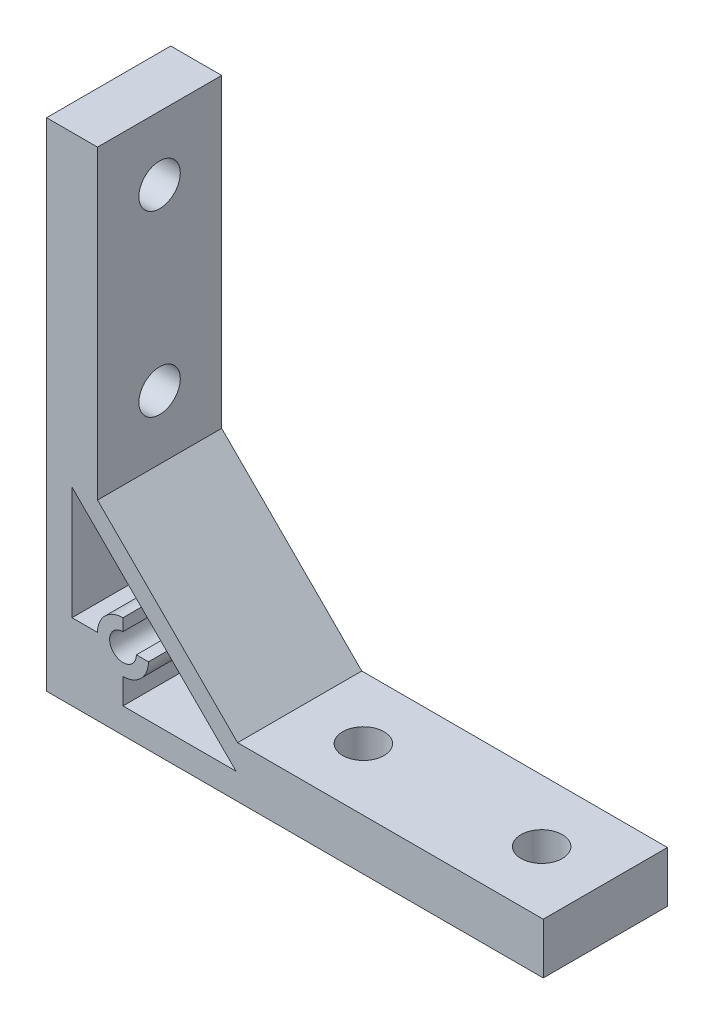
ISO-10303-21;
HEADER;
FILE_DESCRIPTION(('STEP AP214'),'2;1');
FILE_NAME('part.step','',(''),(''),'','','');
FILE_SCHEMA(('AUTOMOTIVE_DESIGN { 1 0 10303 214 1 1 1 1 }'));
ENDSEC;
DATA;
#1=APPLICATION_CONTEXT('core data for automotive mechanical design processes');
#2=APPLICATION_PROTOCOL_DEFINITION('international standard','automotive_design',2000,#1);
#3=PRODUCT_CONTEXT('',#1,'mechanical');
#4=PRODUCT('Part','Part','',(#3));
#5=PRODUCT_RELATED_PRODUCT_CATEGORY('part','',(#4));
#6=PRODUCT_DEFINITION_FORMATION('','',#4);
#7=PRODUCT_DEFINITION_CONTEXT('part definition',#1,'design');
#8=PRODUCT_DEFINITION('design','',#6,#7);
#9=PRODUCT_DEFINITION_SHAPE('','',#8);
#10=(LENGTH_UNIT() NAMED_UNIT(*) SI_UNIT(.MILLI.,.METRE.));
#11=(NAMED_UNIT(*) PLANE_ANGLE_UNIT() SI_UNIT($,.RADIAN.));
#12=(NAMED_UNIT(*) SI_UNIT($,.STERADIAN.) SOLID_ANGLE_UNIT());
#13=UNCERTAINTY_MEASURE_WITH_UNIT(LENGTH_MEASURE(1.E-05),#10,'distance_accuracy_value','');
#14=(GEOMETRIC_REPRESENTATION_CONTEXT(3) GLOBAL_UNCERTAINTY_ASSIGNED_CONTEXT((#13)) GLOBAL_UNIT_ASSIGNED_CONTEXT((#10,
#11,#12)) REPRESENTATION_CONTEXT('',''));
#15=CARTESIAN_POINT('',(0.,0.,0.));
#16=DIRECTION('',(0.,0.,1.));
#17=DIRECTION('',(1.,0.,0.));
#18=AXIS2_PLACEMENT_3D('',#15,#16,#17);
#19=CARTESIAN_POINT('',(6.44947396463209E-13,78.,19.5));
#20=DIRECTION('',(1.,0.,0.));
#21=DIRECTION('',(0.,1.,0.));
#22=AXIS2_PLACEMENT_3D('',#19,#20,#21);
#23=PLANE('',#22);
#24=CARTESIAN_POINT('',(5.62261740936825E-13,68.,9.75));
#25=DIRECTION('',(1.,0.,0.));
#26=DIRECTION('',(0.,1.,0.));
#27=AXIS2_PLACEMENT_3D('',#24,#25,#26);
#28=CIRCLE('',#27,3.25);
#29=CARTESIAN_POINT('',(5.89134549122793E-13,71.25,9.75));
#30=VERTEX_POINT('',#29);
#31=EDGE_CURVE('E329',#30,#30,#28,.F.);
#32=ORIENTED_EDGE('',*,*,#31,.F.);
#33=EDGE_LOOP('',(#32));
#34=FACE_BOUND('',#33,.T.);
#35=CARTESIAN_POINT('',(3.30742225463808E-13,40.,9.75));
#36=DIRECTION('',(1.,0.,0.));
#37=DIRECTION('',(0.,1.,0.));
#38=AXIS2_PLACEMENT_3D('',#35,#36,#37);
#39=CIRCLE('',#38,3.25);
#40=CARTESIAN_POINT('',(3.57615033649775E-13,43.25,9.75));
#41=VERTEX_POINT('',#40);
#42=EDGE_CURVE('E332',#41,#41,#39,.F.);
#43=ORIENTED_EDGE('',*,*,#42,.F.);
#44=EDGE_LOOP('',(#43));
#45=FACE_BOUND('',#44,.T.);
#46=DIRECTION('',(0.,-1.,0.));
#47=VECTOR('',#46,1.);
#48=CARTESIAN_POINT('',(6.44947396463209E-13,78.,0.));
#49=LINE('',#48,#47);
#50=CARTESIAN_POINT('',(6.44947396463209E-13,78.,0.));
#51=VERTEX_POINT('',#50);
#52=CARTESIAN_POINT('',(0.,0.,0.));
#53=VERTEX_POINT('',#52);
#54=EDGE_CURVE('E228',#51,#53,#49,.T.);
#55=ORIENTED_EDGE('',*,*,#54,.T.);
#56=DIRECTION('',(0.,0.,-1.));
#57=VECTOR('',#56,1.);
#58=CARTESIAN_POINT('',(0.,0.,19.5));
#59=LINE('',#58,#57);
#60=CARTESIAN_POINT('',(0.,0.,19.5));
#61=VERTEX_POINT('',#60);
#62=EDGE_CURVE('E41',#61,#53,#59,.T.);
#63=ORIENTED_EDGE('',*,*,#62,.F.);
#64=DIRECTION('',(0.,-1.,0.));
#65=VECTOR('',#64,1.);
#66=CARTESIAN_POINT('',(6.44947396463209E-13,78.,19.5));
#67=LINE('',#66,#65);
#68=CARTESIAN_POINT('',(6.44947396463209E-13,78.,19.5));
#69=VERTEX_POINT('',#68);
#70=EDGE_CURVE('E229',#69,#61,#67,.T.);
#71=ORIENTED_EDGE('',*,*,#70,.F.);
#72=DIRECTION('',(0.,0.,-1.));
#73=VECTOR('',#72,1.);
#74=CARTESIAN_POINT('',(6.44947396463209E-13,78.,19.5));
#75=LINE('',#74,#73);
#76=EDGE_CURVE('E245',#69,#51,#75,.T.);
#77=ORIENTED_EDGE('',*,*,#76,.T.);
#78=EDGE_LOOP('',(#55,#63,#71,#77));
#79=FACE_BOUND('',#78,.T.);
#80=ADVANCED_FACE('F34',(#34,#45,#79),#23,.F.);
#81=CARTESIAN_POINT('',(0.,0.,19.5));
#82=DIRECTION('',(0.,1.,0.));
#83=DIRECTION('',(0.,0.,1.));
#84=AXIS2_PLACEMENT_3D('',#81,#82,#83);
#85=PLANE('',#84);
#86=CARTESIAN_POINT('',(40.0000000000007,0.,9.75));
#87=DIRECTION('',(0.,1.,0.));
#88=DIRECTION('',(0.,0.,1.));
#89=AXIS2_PLACEMENT_3D('',#86,#87,#88);
#90=CIRCLE('',#89,3.25);
#91=CARTESIAN_POINT('',(40.0000000000007,0.,13.));
#92=VERTEX_POINT('',#91);
#93=EDGE_CURVE('E346',#92,#92,#90,.F.);
#94=ORIENTED_EDGE('',*,*,#93,.F.);
#95=EDGE_LOOP('',(#94));
#96=FACE_BOUND('',#95,.T.);
#97=CARTESIAN_POINT('',(68.0000000000007,0.,9.75));
#98=DIRECTION('',(0.,1.,0.));
#99=DIRECTION('',(0.,0.,1.));
#100=AXIS2_PLACEMENT_3D('',#97,#98,#99);
#101=CIRCLE('',#100,3.25000000000001);
#102=CARTESIAN_POINT('',(68.0000000000007,0.,13.));
#103=VERTEX_POINT('',#102);
#104=EDGE_CURVE('E347',#103,#103,#101,.F.);
#105=ORIENTED_EDGE('',*,*,#104,.F.);
#106=EDGE_LOOP('',(#105));
#107=FACE_BOUND('',#106,.T.);
#108=DIRECTION('',(1.,0.,0.));
#109=VECTOR('',#108,1.);
#110=CARTESIAN_POINT('',(0.,0.,0.));
#111=LINE('',#110,#109);
#112=CARTESIAN_POINT('',(78.,0.,0.));
#113=VERTEX_POINT('',#112);
#114=EDGE_CURVE('E248',#53,#113,#111,.T.);
#115=ORIENTED_EDGE('',*,*,#114,.T.);
#116=DIRECTION('',(0.,0.,-1.));
#117=VECTOR('',#116,1.);
#118=CARTESIAN_POINT('',(78.,0.,19.5));
#119=LINE('',#118,#117);
#120=CARTESIAN_POINT('',(78.,0.,19.5));
#121=VERTEX_POINT('',#120);
#122=EDGE_CURVE('E273',#121,#113,#119,.T.);
#123=ORIENTED_EDGE('',*,*,#122,.F.);
#124=DIRECTION('',(1.,0.,0.));
#125=VECTOR('',#124,1.);
#126=CARTESIAN_POINT('',(0.,0.,19.5));
#127=LINE('',#126,#125);
#128=EDGE_CURVE('E232',#61,#121,#127,.T.);
#129=ORIENTED_EDGE('',*,*,#128,.F.);
#130=ORIENTED_EDGE('',*,*,#62,.T.);
#131=EDGE_LOOP('',(#115,#123,#129,#130));
#132=FACE_BOUND('',#131,.T.);
#133=ADVANCED_FACE('F278',(#96,#107,#132),#85,.F.);
#134=CARTESIAN_POINT('',(78.,0.,19.5));
#135=DIRECTION('',(-1.,0.,0.));
#136=DIRECTION('',(0.,0.,1.));
#137=AXIS2_PLACEMENT_3D('',#134,#135,#136);
#138=PLANE('',#137);
#139=DIRECTION('',(0.,1.,0.));
#140=VECTOR('',#139,1.);
#141=CARTESIAN_POINT('',(78.,0.,0.));
#142=LINE('',#141,#140);
#143=CARTESIAN_POINT('',(78.,8.,0.));
#144=VERTEX_POINT('',#143);
#145=EDGE_CURVE('E250',#113,#144,#142,.T.);
#146=ORIENTED_EDGE('',*,*,#145,.T.);
#147=DIRECTION('',(0.,0.,-1.));
#148=VECTOR('',#147,1.);
#149=CARTESIAN_POINT('',(78.,8.,19.5));
#150=LINE('',#149,#148);
#151=CARTESIAN_POINT('',(78.,8.,19.5));
#152=VERTEX_POINT('',#151);
#153=EDGE_CURVE('E270',#152,#144,#150,.T.);
#154=ORIENTED_EDGE('',*,*,#153,.F.);
#155=DIRECTION('',(0.,1.,0.));
#156=VECTOR('',#155,1.);
#157=CARTESIAN_POINT('',(78.,0.,19.5));
#158=LINE('',#157,#156);
#159=EDGE_CURVE('E235',#121,#152,#158,.T.);
#160=ORIENTED_EDGE('',*,*,#159,.F.);
#161=ORIENTED_EDGE('',*,*,#122,.T.);
#162=EDGE_LOOP('',(#146,#154,#160,#161));
#163=FACE_BOUND('',#162,.T.);
#164=ADVANCED_FACE('F291',(#163),#138,.F.);
#165=CARTESIAN_POINT('',(78.,8.,19.5));
#166=DIRECTION('',(0.,-1.,0.));
#167=DIRECTION('',(1.,0.,0.));
#168=AXIS2_PLACEMENT_3D('',#165,#166,#167);
#169=PLANE('',#168);
#170=CARTESIAN_POINT('',(40.0000000000007,7.99999999999999,9.75));
#171=DIRECTION('',(0.,1.,0.));
#172=DIRECTION('',(-1.,0.,0.));
#173=AXIS2_PLACEMENT_3D('',#170,#171,#172);
#174=CIRCLE('',#173,3.25);
#175=CARTESIAN_POINT('',(36.7500000000007,7.99999999999999,9.75));
#176=VERTEX_POINT('',#175);
#177=EDGE_CURVE('E343',#176,#176,#174,.T.);
#178=ORIENTED_EDGE('',*,*,#177,.F.);
#179=EDGE_LOOP('',(#178));
#180=FACE_BOUND('',#179,.T.);
#181=CARTESIAN_POINT('',(68.0000000000007,8.,9.75));
#182=DIRECTION('',(0.,1.,0.));
#183=DIRECTION('',(-1.,0.,0.));
#184=AXIS2_PLACEMENT_3D('',#181,#182,#183);
#185=CIRCLE('',#184,3.25000000000001);
#186=CARTESIAN_POINT('',(64.7500000000007,8.,9.75));
#187=VERTEX_POINT('',#186);
#188=EDGE_CURVE('E350',#187,#187,#185,.T.);
#189=ORIENTED_EDGE('',*,*,#188,.F.);
#190=EDGE_LOOP('',(#189));
#191=FACE_BOUND('',#190,.T.);
#192=DIRECTION('',(-1.,0.,0.));
#193=VECTOR('',#192,1.);
#194=CARTESIAN_POINT('',(78.,8.,0.));
#195=LINE('',#194,#193);
#196=CARTESIAN_POINT('',(30.,7.99999999999999,0.));
#197=VERTEX_POINT('',#196);
#198=EDGE_CURVE('E252',#144,#197,#195,.T.);
#199=ORIENTED_EDGE('',*,*,#198,.T.);
#200=DIRECTION('',(0.,0.,-1.));
#201=VECTOR('',#200,1.);
#202=CARTESIAN_POINT('',(30.,7.99999999999999,19.5));
#203=LINE('',#202,#201);
#204=CARTESIAN_POINT('',(30.,7.99999999999999,19.5));
#205=VERTEX_POINT('',#204);
#206=EDGE_CURVE('E267',#205,#197,#203,.T.);
#207=ORIENTED_EDGE('',*,*,#206,.F.);
#208=DIRECTION('',(-1.,0.,0.));
#209=VECTOR('',#208,1.);
#210=CARTESIAN_POINT('',(78.,8.,19.5));
#211=LINE('',#210,#209);
#212=EDGE_CURVE('E237',#152,#205,#211,.T.);
#213=ORIENTED_EDGE('',*,*,#212,.F.);
#214=ORIENTED_EDGE('',*,*,#153,.T.);
#215=EDGE_LOOP('',(#199,#207,#213,#214));
#216=FACE_BOUND('',#215,.T.);
#217=ADVANCED_FACE('F295',(#180,#191,#216),#169,.F.);
#218=CARTESIAN_POINT('',(30.,7.99999999999999,19.5));
#219=DIRECTION('',(-0.707106781186549,-0.707106781186546,0.));
#220=DIRECTION('',(0.707106781186546,-0.707106781186549,0.));
#221=AXIS2_PLACEMENT_3D('',#218,#219,#220);
#222=PLANE('',#221);
#223=DIRECTION('',(-0.707106781186546,0.707106781186549,0.));
#224=VECTOR('',#223,1.);
#225=CARTESIAN_POINT('',(30.,7.99999999999999,0.));
#226=LINE('',#225,#224);
#227=CARTESIAN_POINT('',(8.,30.0000000000001,0.));
#228=VERTEX_POINT('',#227);
#229=EDGE_CURVE('E254',#197,#228,#226,.T.);
#230=ORIENTED_EDGE('',*,*,#229,.T.);
#231=DIRECTION('',(0.,0.,-1.));
#232=VECTOR('',#231,1.);
#233=CARTESIAN_POINT('',(8.,30.0000000000001,19.5));
#234=LINE('',#233,#232);
#235=CARTESIAN_POINT('',(8.,30.0000000000001,19.5));
#236=VERTEX_POINT('',#235);
#237=EDGE_CURVE('E264',#236,#228,#234,.T.);
#238=ORIENTED_EDGE('',*,*,#237,.F.);
#239=DIRECTION('',(-0.707106781186546,0.707106781186549,0.));
#240=VECTOR('',#239,1.);
#241=CARTESIAN_POINT('',(30.,7.99999999999999,19.5));
#242=LINE('',#241,#240);
#243=EDGE_CURVE('E239',#205,#236,#242,.T.);
#244=ORIENTED_EDGE('',*,*,#243,.F.);
#245=ORIENTED_EDGE('',*,*,#206,.T.);
#246=EDGE_LOOP('',(#230,#238,#244,#245));
#247=FACE_BOUND('',#246,.T.);
#248=ADVANCED_FACE('F309',(#247),#222,.F.);
#249=CARTESIAN_POINT('',(8.,30.0000000000001,19.5));
#250=DIRECTION('',(-1.,0.,0.));
#251=DIRECTION('',(0.,0.,1.));
#252=AXIS2_PLACEMENT_3D('',#249,#250,#251);
#253=PLANE('',#252);
#254=CARTESIAN_POINT('',(8.,68.,9.75));
#255=DIRECTION('',(1.,0.,0.));
#256=DIRECTION('',(0.,0.,-1.));
#257=AXIS2_PLACEMENT_3D('',#254,#255,#256);
#258=CIRCLE('',#257,3.25);
#259=CARTESIAN_POINT('',(8.,68.,6.5));
#260=VERTEX_POINT('',#259);
#261=EDGE_CURVE('E334',#260,#260,#258,.T.);
#262=ORIENTED_EDGE('',*,*,#261,.F.);
#263=EDGE_LOOP('',(#262));
#264=FACE_BOUND('',#263,.T.);
#265=CARTESIAN_POINT('',(8.,40.,9.75));
#266=DIRECTION('',(1.,0.,0.));
#267=DIRECTION('',(0.,0.,-1.));
#268=AXIS2_PLACEMENT_3D('',#265,#266,#267);
#269=CIRCLE('',#268,3.25);
#270=CARTESIAN_POINT('',(8.,40.,6.5));
#271=VERTEX_POINT('',#270);
#272=EDGE_CURVE('E335',#271,#271,#269,.T.);
#273=ORIENTED_EDGE('',*,*,#272,.F.);
#274=EDGE_LOOP('',(#273));
#275=FACE_BOUND('',#274,.T.);
#276=DIRECTION('',(0.,1.,0.));
#277=VECTOR('',#276,1.);
#278=CARTESIAN_POINT('',(8.,30.0000000000001,0.));
#279=LINE('',#278,#277);
#280=CARTESIAN_POINT('',(8.,78.,0.));
#281=VERTEX_POINT('',#280);
#282=EDGE_CURVE('E256',#228,#281,#279,.T.);
#283=ORIENTED_EDGE('',*,*,#282,.T.);
#284=DIRECTION('',(0.,0.,-1.));
#285=VECTOR('',#284,1.);
#286=CARTESIAN_POINT('',(8.,78.,19.5));
#287=LINE('',#286,#285);
#288=CARTESIAN_POINT('',(8.,78.,19.5));
#289=VERTEX_POINT('',#288);
#290=EDGE_CURVE('E261',#289,#281,#287,.T.);
#291=ORIENTED_EDGE('',*,*,#290,.F.);
#292=DIRECTION('',(0.,1.,0.));
#293=VECTOR('',#292,1.);
#294=CARTESIAN_POINT('',(8.,30.0000000000001,19.5));
#295=LINE('',#294,#293);
#296=EDGE_CURVE('E241',#236,#289,#295,.T.);
#297=ORIENTED_EDGE('',*,*,#296,.F.);
#298=ORIENTED_EDGE('',*,*,#237,.T.);
#299=EDGE_LOOP('',(#283,#291,#297,#298));
#300=FACE_BOUND('',#299,.T.);
#301=ADVANCED_FACE('F307',(#264,#275,#300),#253,.F.);
#302=CARTESIAN_POINT('',(8.,78.,19.5));
#303=DIRECTION('',(0.,-1.,0.));
#304=DIRECTION('',(0.,0.,-1.));
#305=AXIS2_PLACEMENT_3D('',#302,#303,#304);
#306=PLANE('',#305);
#307=DIRECTION('',(-1.,0.,0.));
#308=VECTOR('',#307,1.);
#309=CARTESIAN_POINT('',(8.,78.,0.));
#310=LINE('',#309,#308);
#311=EDGE_CURVE('E233',#281,#51,#310,.T.);
#312=ORIENTED_EDGE('',*,*,#311,.T.);
#313=ORIENTED_EDGE('',*,*,#76,.F.);
#314=DIRECTION('',(-1.,0.,0.));
#315=VECTOR('',#314,1.);
#316=CARTESIAN_POINT('',(8.,78.,19.5));
#317=LINE('',#316,#315);
#318=EDGE_CURVE('E243',#289,#69,#317,.T.);
#319=ORIENTED_EDGE('',*,*,#318,.F.);
#320=ORIENTED_EDGE('',*,*,#290,.T.);
#321=EDGE_LOOP('',(#312,#313,#319,#320));
#322=FACE_BOUND('',#321,.T.);
#323=ADVANCED_FACE('F305',(#322),#306,.F.);
#324=CARTESIAN_POINT('',(0.,0.,19.5));
#325=DIRECTION('',(0.,0.,1.));
#326=DIRECTION('',(1.,0.,0.));
#327=AXIS2_PLACEMENT_3D('',#324,#325,#326);
#328=PLANE('',#327);
#329=CARTESIAN_POINT('',(12.0000000000006,12.,19.5));
#330=DIRECTION('',(0.,0.,1.));
#331=DIRECTION('',(1.,0.,0.));
#332=AXIS2_PLACEMENT_3D('',#329,#330,#331);
#333=CIRCLE('',#332,2.1);
#334=CARTESIAN_POINT('',(12.0000000000006,14.1,19.5));
#335=VERTEX_POINT('',#334);
#336=CARTESIAN_POINT('',(14.1000000000006,12.,19.5));
#337=VERTEX_POINT('',#336);
#338=EDGE_CURVE('E153',#335,#337,#333,.T.);
#339=ORIENTED_EDGE('',*,*,#338,.F.);
#340=DIRECTION('',(0.,1.,0.));
#341=VECTOR('',#340,1.);
#342=CARTESIAN_POINT('',(12.0000000000006,12.,19.5));
#343=LINE('',#342,#341);
#344=CARTESIAN_POINT('',(12.0000000000006,16.,19.5));
#345=VERTEX_POINT('',#344);
#346=EDGE_CURVE('E182',#335,#345,#343,.T.);
#347=ORIENTED_EDGE('',*,*,#346,.T.);
#348=CARTESIAN_POINT('',(12.0000000000006,12.,19.5));
#349=DIRECTION('',(0.,0.,1.));
#350=DIRECTION('',(1.,0.,0.));
#351=AXIS2_PLACEMENT_3D('',#348,#349,#350);
#352=CIRCLE('',#351,4.);
#353=CARTESIAN_POINT('',(8.00000000000064,12.,19.5));
#354=VERTEX_POINT('',#353);
#355=EDGE_CURVE('E185',#345,#354,#352,.T.);
#356=ORIENTED_EDGE('',*,*,#355,.T.);
#357=DIRECTION('',(1.,0.,0.));
#358=VECTOR('',#357,1.);
#359=CARTESIAN_POINT('',(4.00000000000065,12.,19.5));
#360=LINE('',#359,#358);
#361=CARTESIAN_POINT('',(4.00000000000065,12.,19.5));
#362=VERTEX_POINT('',#361);
#363=EDGE_CURVE('E206',#362,#354,#360,.T.);
#364=ORIENTED_EDGE('',*,*,#363,.F.);
#365=DIRECTION('',(0.,-1.,0.));
#366=VECTOR('',#365,1.);
#367=CARTESIAN_POINT('',(4.00000000000065,12.,19.5));
#368=LINE('',#367,#366);
#369=CARTESIAN_POINT('',(4.00000000000065,29.7573593128801,19.5));
#370=VERTEX_POINT('',#369);
#371=EDGE_CURVE('E204',#370,#362,#368,.T.);
#372=ORIENTED_EDGE('',*,*,#371,.F.);
#373=DIRECTION('',(-0.707106781186547,0.707106781186548,0.));
#374=VECTOR('',#373,1.);
#375=CARTESIAN_POINT('',(4.00000000000065,29.7573593128801,19.5));
#376=LINE('',#375,#374);
#377=CARTESIAN_POINT('',(29.7573593128807,4.,19.5));
#378=VERTEX_POINT('',#377);
#379=EDGE_CURVE('E213',#378,#370,#376,.T.);
#380=ORIENTED_EDGE('',*,*,#379,.F.);
#381=DIRECTION('',(1.,0.,0.));
#382=VECTOR('',#381,1.);
#383=CARTESIAN_POINT('',(29.7573593128807,4.,19.5));
#384=LINE('',#383,#382);
#385=CARTESIAN_POINT('',(12.0000000000006,4.,19.5));
#386=VERTEX_POINT('',#385);
#387=EDGE_CURVE('E210',#386,#378,#384,.T.);
#388=ORIENTED_EDGE('',*,*,#387,.F.);
#389=DIRECTION('',(0.,-1.,0.));
#390=VECTOR('',#389,1.);
#391=CARTESIAN_POINT('',(12.0000000000006,12.,19.5));
#392=LINE('',#391,#390);
#393=CARTESIAN_POINT('',(12.0000000000006,8.,19.5));
#394=VERTEX_POINT('',#393);
#395=EDGE_CURVE('E208',#394,#386,#392,.T.);
#396=ORIENTED_EDGE('',*,*,#395,.F.);
#397=CARTESIAN_POINT('',(16.0000000000006,12.,19.5));
#398=VERTEX_POINT('',#397);
#399=EDGE_CURVE('E184',#394,#398,#352,.T.);
#400=ORIENTED_EDGE('',*,*,#399,.T.);
#401=DIRECTION('',(-1.,0.,0.));
#402=VECTOR('',#401,1.);
#403=CARTESIAN_POINT('',(12.0000000000006,12.,19.5));
#404=LINE('',#403,#402);
#405=EDGE_CURVE('E169',#398,#337,#404,.T.);
#406=ORIENTED_EDGE('',*,*,#405,.T.);
#407=EDGE_LOOP('',(#339,#347,#356,#364,#372,#380,#388,#396,#400,#406));
#408=FACE_BOUND('',#407,.T.);
#409=ORIENTED_EDGE('',*,*,#70,.T.);
#410=ORIENTED_EDGE('',*,*,#128,.T.);
#411=ORIENTED_EDGE('',*,*,#159,.T.);
#412=ORIENTED_EDGE('',*,*,#212,.T.);
#413=ORIENTED_EDGE('',*,*,#243,.T.);
#414=ORIENTED_EDGE('',*,*,#296,.T.);
#415=ORIENTED_EDGE('',*,*,#318,.T.);
#416=EDGE_LOOP('',(#409,#410,#411,#412,#413,#414,#415));
#417=FACE_BOUND('',#416,.T.);
#418=ADVANCED_FACE('F299',(#408,#417),#328,.T.);
#419=CARTESIAN_POINT('',(0.,0.,0.));
#420=DIRECTION('',(0.,0.,1.));
#421=DIRECTION('',(1.,0.,0.));
#422=AXIS2_PLACEMENT_3D('',#419,#420,#421);
#423=PLANE('',#422);
#424=DIRECTION('',(0.,-1.,0.));
#425=VECTOR('',#424,1.);
#426=CARTESIAN_POINT('',(12.0000000000006,12.,0.));
#427=LINE('',#426,#425);
#428=CARTESIAN_POINT('',(12.0000000000006,16.,0.));
#429=VERTEX_POINT('',#428);
#430=CARTESIAN_POINT('',(12.0000000000006,14.1,0.));
#431=VERTEX_POINT('',#430);
#432=EDGE_CURVE('E168',#429,#431,#427,.T.);
#433=ORIENTED_EDGE('',*,*,#432,.T.);
#434=CARTESIAN_POINT('',(12.0000000000006,12.,0.));
#435=DIRECTION('',(0.,0.,1.));
#436=DIRECTION('',(1.,0.,0.));
#437=AXIS2_PLACEMENT_3D('',#434,#435,#436);
#438=CIRCLE('',#437,2.1);
#439=CARTESIAN_POINT('',(14.1000000000006,12.,0.));
#440=VERTEX_POINT('',#439);
#441=EDGE_CURVE('E48',#440,#431,#438,.F.);
#442=ORIENTED_EDGE('',*,*,#441,.F.);
#443=DIRECTION('',(1.,0.,0.));
#444=VECTOR('',#443,1.);
#445=CARTESIAN_POINT('',(12.0000000000006,12.,0.));
#446=LINE('',#445,#444);
#447=CARTESIAN_POINT('',(16.0000000000006,12.,0.));
#448=VERTEX_POINT('',#447);
#449=EDGE_CURVE('E165',#440,#448,#446,.T.);
#450=ORIENTED_EDGE('',*,*,#449,.T.);
#451=CARTESIAN_POINT('',(12.0000000000006,12.,0.));
#452=DIRECTION('',(0.,0.,1.));
#453=DIRECTION('',(1.,0.,0.));
#454=AXIS2_PLACEMENT_3D('',#451,#452,#453);
#455=CIRCLE('',#454,4.);
#456=CARTESIAN_POINT('',(12.0000000000006,8.,0.));
#457=VERTEX_POINT('',#456);
#458=EDGE_CURVE('E175',#448,#457,#455,.F.);
#459=ORIENTED_EDGE('',*,*,#458,.T.);
#460=DIRECTION('',(0.,1.,0.));
#461=VECTOR('',#460,1.);
#462=CARTESIAN_POINT('',(12.0000000000006,12.,0.));
#463=LINE('',#462,#461);
#464=CARTESIAN_POINT('',(12.0000000000006,4.,0.));
#465=VERTEX_POINT('',#464);
#466=EDGE_CURVE('E193',#465,#457,#463,.T.);
#467=ORIENTED_EDGE('',*,*,#466,.F.);
#468=DIRECTION('',(-1.,0.,0.));
#469=VECTOR('',#468,1.);
#470=CARTESIAN_POINT('',(29.7573593128807,4.,0.));
#471=LINE('',#470,#469);
#472=CARTESIAN_POINT('',(29.7573593128807,4.,0.));
#473=VERTEX_POINT('',#472);
#474=EDGE_CURVE('E195',#473,#465,#471,.T.);
#475=ORIENTED_EDGE('',*,*,#474,.F.);
#476=DIRECTION('',(0.707106781186548,-0.707106781186548,0.));
#477=VECTOR('',#476,1.);
#478=CARTESIAN_POINT('',(4.00000000000065,29.7573593128801,0.));
#479=LINE('',#478,#477);
#480=CARTESIAN_POINT('',(4.00000000000065,29.7573593128801,0.));
#481=VERTEX_POINT('',#480);
#482=EDGE_CURVE('E198',#481,#473,#479,.T.);
#483=ORIENTED_EDGE('',*,*,#482,.F.);
#484=DIRECTION('',(0.,1.,0.));
#485=VECTOR('',#484,1.);
#486=CARTESIAN_POINT('',(4.00000000000065,12.,0.));
#487=LINE('',#486,#485);
#488=CARTESIAN_POINT('',(4.00000000000065,12.,0.));
#489=VERTEX_POINT('',#488);
#490=EDGE_CURVE('E201',#489,#481,#487,.T.);
#491=ORIENTED_EDGE('',*,*,#490,.F.);
#492=DIRECTION('',(-1.,0.,0.));
#493=VECTOR('',#492,1.);
#494=CARTESIAN_POINT('',(4.00000000000065,12.,0.));
#495=LINE('',#494,#493);
#496=CARTESIAN_POINT('',(8.00000000000064,12.,0.));
#497=VERTEX_POINT('',#496);
#498=EDGE_CURVE('E219',#497,#489,#495,.T.);
#499=ORIENTED_EDGE('',*,*,#498,.F.);
#500=EDGE_CURVE('E178',#497,#429,#455,.F.);
#501=ORIENTED_EDGE('',*,*,#500,.T.);
#502=EDGE_LOOP('',(#433,#442,#450,#459,#467,#475,#483,#491,#499,#501));
#503=FACE_BOUND('',#502,.T.);
#504=ORIENTED_EDGE('',*,*,#54,.F.);
#505=ORIENTED_EDGE('',*,*,#311,.F.);
#506=ORIENTED_EDGE('',*,*,#282,.F.);
#507=ORIENTED_EDGE('',*,*,#229,.F.);
#508=ORIENTED_EDGE('',*,*,#198,.F.);
#509=ORIENTED_EDGE('',*,*,#145,.F.);
#510=ORIENTED_EDGE('',*,*,#114,.F.);
#511=EDGE_LOOP('',(#504,#505,#506,#507,#508,#509,#510));
#512=FACE_BOUND('',#511,.T.);
#513=ADVANCED_FACE('F162',(#503,#512),#423,.F.);
#514=CARTESIAN_POINT('',(4.00000000000065,12.,-0.001000000000001));
#515=DIRECTION('',(-1.,0.,0.));
#516=DIRECTION('',(0.,0.,1.));
#517=AXIS2_PLACEMENT_3D('',#514,#515,#516);
#518=PLANE('',#517);
#519=ORIENTED_EDGE('',*,*,#490,.T.);
#520=DIRECTION('',(0.,0.,1.));
#521=VECTOR('',#520,1.);
#522=CARTESIAN_POINT('',(4.00000000000065,29.7573593128801,-0.001000000000001));
#523=LINE('',#522,#521);
#524=EDGE_CURVE('E217',#481,#370,#523,.T.);
#525=ORIENTED_EDGE('',*,*,#524,.T.);
#526=ORIENTED_EDGE('',*,*,#371,.T.);
#527=DIRECTION('',(0.,0.,1.));
#528=VECTOR('',#527,1.);
#529=CARTESIAN_POINT('',(4.00000000000065,12.,-0.001000000000001));
#530=LINE('',#529,#528);
#531=EDGE_CURVE('E216',#489,#362,#530,.T.);
#532=ORIENTED_EDGE('',*,*,#531,.F.);
#533=EDGE_LOOP('',(#519,#525,#526,#532));
#534=FACE_BOUND('',#533,.T.);
#535=ADVANCED_FACE('F376',(#534),#518,.F.);
#536=CARTESIAN_POINT('',(4.00000000000065,29.7573593128801,-0.001000000000001));
#537=DIRECTION('',(0.707106781186548,0.707106781186548,0.));
#538=DIRECTION('',(-0.707106781186548,0.707106781186548,0.));
#539=AXIS2_PLACEMENT_3D('',#536,#537,#538);
#540=PLANE('',#539);
#541=ORIENTED_EDGE('',*,*,#482,.T.);
#542=DIRECTION('',(0.,0.,1.));
#543=VECTOR('',#542,1.);
#544=CARTESIAN_POINT('',(29.7573593128807,4.,-0.001000000000001));
#545=LINE('',#544,#543);
#546=EDGE_CURVE('E220',#473,#378,#545,.T.);
#547=ORIENTED_EDGE('',*,*,#546,.T.);
#548=ORIENTED_EDGE('',*,*,#379,.T.);
#549=ORIENTED_EDGE('',*,*,#524,.F.);
#550=EDGE_LOOP('',(#541,#547,#548,#549));
#551=FACE_BOUND('',#550,.T.);
#552=ADVANCED_FACE('F372',(#551),#540,.F.);
#553=CARTESIAN_POINT('',(29.7573593128807,4.,-0.001000000000001));
#554=DIRECTION('',(0.,-1.,0.));
#555=DIRECTION('',(0.,0.,-1.));
#556=AXIS2_PLACEMENT_3D('',#553,#554,#555);
#557=PLANE('',#556);
#558=ORIENTED_EDGE('',*,*,#474,.T.);
#559=DIRECTION('',(0.,0.,1.));
#560=VECTOR('',#559,1.);
#561=CARTESIAN_POINT('',(12.0000000000006,4.,-0.001000000000001));
#562=LINE('',#561,#560);
#563=EDGE_CURVE('E222',#465,#386,#562,.T.);
#564=ORIENTED_EDGE('',*,*,#563,.T.);
#565=ORIENTED_EDGE('',*,*,#387,.T.);
#566=ORIENTED_EDGE('',*,*,#546,.F.);
#567=EDGE_LOOP('',(#558,#564,#565,#566));
#568=FACE_BOUND('',#567,.T.);
#569=ADVANCED_FACE('F369',(#568),#557,.F.);
#570=CARTESIAN_POINT('',(12.0000000000006,12.,-0.001000000000001));
#571=DIRECTION('',(-1.,0.,0.));
#572=DIRECTION('',(0.,0.,1.));
#573=AXIS2_PLACEMENT_3D('',#570,#571,#572);
#574=PLANE('',#573);
#575=ORIENTED_EDGE('',*,*,#466,.T.);
#576=DIRECTION('',(0.,0.,1.));
#577=VECTOR('',#576,1.);
#578=CARTESIAN_POINT('',(12.0000000000006,8.,-11.3137084989848));
#579=LINE('',#578,#577);
#580=EDGE_CURVE('E56',#457,#394,#579,.T.);
#581=ORIENTED_EDGE('',*,*,#580,.T.);
#582=ORIENTED_EDGE('',*,*,#395,.T.);
#583=ORIENTED_EDGE('',*,*,#563,.F.);
#584=EDGE_LOOP('',(#575,#581,#582,#583));
#585=FACE_BOUND('',#584,.T.);
#586=ADVANCED_FACE('F367',(#585),#574,.F.);
#587=CARTESIAN_POINT('',(4.00000000000065,12.,-0.001000000000001));
#588=DIRECTION('',(0.,-1.,0.));
#589=DIRECTION('',(0.,0.,-1.));
#590=AXIS2_PLACEMENT_3D('',#587,#588,#589);
#591=PLANE('',#590);
#592=ORIENTED_EDGE('',*,*,#363,.T.);
#593=DIRECTION('',(0.,0.,1.));
#594=VECTOR('',#593,1.);
#595=CARTESIAN_POINT('',(8.00000000000064,12.,-11.3137084989848));
#596=LINE('',#595,#594);
#597=EDGE_CURVE('E11',#354,#497,#596,.F.);
#598=ORIENTED_EDGE('',*,*,#597,.T.);
#599=ORIENTED_EDGE('',*,*,#498,.T.);
#600=ORIENTED_EDGE('',*,*,#531,.T.);
#601=EDGE_LOOP('',(#592,#598,#599,#600));
#602=FACE_BOUND('',#601,.T.);
#603=ADVANCED_FACE('F380',(#602),#591,.F.);
#604=CARTESIAN_POINT('',(12.0000000000006,12.,-11.3137084989848));
#605=DIRECTION('',(0.,0.,1.));
#606=DIRECTION('',(1.,0.,0.));
#607=AXIS2_PLACEMENT_3D('',#604,#605,#606);
#608=CYLINDRICAL_SURFACE('',#607,4.);
#609=ORIENTED_EDGE('',*,*,#580,.F.);
#610=ORIENTED_EDGE('',*,*,#458,.F.);
#611=DIRECTION('',(0.,0.,1.));
#612=VECTOR('',#611,1.);
#613=CARTESIAN_POINT('',(16.0000000000006,12.,-11.3137084989848));
#614=LINE('',#613,#612);
#615=EDGE_CURVE('E174',#448,#398,#614,.T.);
#616=ORIENTED_EDGE('',*,*,#615,.T.);
#617=ORIENTED_EDGE('',*,*,#399,.F.);
#618=EDGE_LOOP('',(#609,#610,#616,#617));
#619=FACE_BOUND('',#618,.T.);
#620=ADVANCED_FACE('F363',(#619),#608,.T.);
#621=ORIENTED_EDGE('',*,*,#597,.F.);
#622=ORIENTED_EDGE('',*,*,#355,.F.);
#623=DIRECTION('',(0.,0.,1.));
#624=VECTOR('',#623,1.);
#625=CARTESIAN_POINT('',(12.0000000000006,16.,-11.3137084989848));
#626=LINE('',#625,#624);
#627=EDGE_CURVE('E188',#429,#345,#626,.T.);
#628=ORIENTED_EDGE('',*,*,#627,.F.);
#629=ORIENTED_EDGE('',*,*,#500,.F.);
#630=EDGE_LOOP('',(#621,#622,#628,#629));
#631=FACE_BOUND('',#630,.T.);
#632=ADVANCED_FACE('F385',(#631),#608,.T.);
#633=CARTESIAN_POINT('',(12.0000000000006,12.,-11.3137084989848));
#634=DIRECTION('',(0.,1.,0.));
#635=DIRECTION('',(0.,0.,1.));
#636=AXIS2_PLACEMENT_3D('',#633,#634,#635);
#637=PLANE('',#636);
#638=DIRECTION('',(0.,0.,1.));
#639=VECTOR('',#638,1.);
#640=CARTESIAN_POINT('',(14.1000000000006,12.,-0.001000000000001));
#641=LINE('',#640,#639);
#642=EDGE_CURVE('E150',#440,#337,#641,.T.);
#643=ORIENTED_EDGE('',*,*,#642,.T.);
#644=ORIENTED_EDGE('',*,*,#405,.F.);
#645=ORIENTED_EDGE('',*,*,#615,.F.);
#646=ORIENTED_EDGE('',*,*,#449,.F.);
#647=EDGE_LOOP('',(#643,#644,#645,#646));
#648=FACE_BOUND('',#647,.T.);
#649=ADVANCED_FACE('F172',(#648),#637,.T.);
#650=CARTESIAN_POINT('',(12.0000000000006,12.,-11.3137084989848));
#651=DIRECTION('',(1.,0.,0.));
#652=DIRECTION('',(0.,0.,-1.));
#653=AXIS2_PLACEMENT_3D('',#650,#651,#652);
#654=PLANE('',#653);
#655=DIRECTION('',(0.,0.,1.));
#656=VECTOR('',#655,1.);
#657=CARTESIAN_POINT('',(12.0000000000006,14.1,-0.001000000000001));
#658=LINE('',#657,#656);
#659=EDGE_CURVE('E158',#335,#431,#658,.F.);
#660=ORIENTED_EDGE('',*,*,#659,.T.);
#661=ORIENTED_EDGE('',*,*,#432,.F.);
#662=ORIENTED_EDGE('',*,*,#627,.T.);
#663=ORIENTED_EDGE('',*,*,#346,.F.);
#664=EDGE_LOOP('',(#660,#661,#662,#663));
#665=FACE_BOUND('',#664,.T.);
#666=ADVANCED_FACE('F358',(#665),#654,.T.);
#667=CARTESIAN_POINT('',(12.0000000000006,12.,-0.001000000000001));
#668=DIRECTION('',(0.,0.,1.));
#669=DIRECTION('',(1.,0.,0.));
#670=AXIS2_PLACEMENT_3D('',#667,#668,#669);
#671=CYLINDRICAL_SURFACE('',#670,2.1);
#672=ORIENTED_EDGE('',*,*,#441,.T.);
#673=ORIENTED_EDGE('',*,*,#659,.F.);
#674=ORIENTED_EDGE('',*,*,#338,.T.);
#675=ORIENTED_EDGE('',*,*,#642,.F.);
#676=EDGE_LOOP('',(#672,#673,#674,#675));
#677=FACE_BOUND('',#676,.T.);
#678=ADVANCED_FACE('F151',(#677),#671,.F.);
#679=CARTESIAN_POINT('',(68.0000000000007,-0.000999999999999265,9.75));
#680=DIRECTION('',(0.,1.,0.));
#681=DIRECTION('',(-1.,0.,0.));
#682=AXIS2_PLACEMENT_3D('',#679,#680,#681);
#683=CYLINDRICAL_SURFACE('',#682,3.25000000000001);
#684=ORIENTED_EDGE('',*,*,#188,.T.);
#685=EDGE_LOOP('',(#684));
#686=FACE_BOUND('',#685,.T.);
#687=ORIENTED_EDGE('',*,*,#104,.T.);
#688=EDGE_LOOP('',(#687));
#689=FACE_BOUND('',#688,.T.);
#690=ADVANCED_FACE('F474',(#686,#689),#683,.F.);
#691=CARTESIAN_POINT('',(40.0000000000007,-0.00100000000000447,9.75));
#692=DIRECTION('',(0.,1.,0.));
#693=DIRECTION('',(-1.,0.,0.));
#694=AXIS2_PLACEMENT_3D('',#691,#692,#693);
#695=CYLINDRICAL_SURFACE('',#694,3.25);
#696=ORIENTED_EDGE('',*,*,#177,.T.);
#697=EDGE_LOOP('',(#696));
#698=FACE_BOUND('',#697,.T.);
#699=ORIENTED_EDGE('',*,*,#93,.T.);
#700=EDGE_LOOP('',(#699));
#701=FACE_BOUND('',#700,.T.);
#702=ADVANCED_FACE('F482',(#698,#701),#695,.F.);
#703=CARTESIAN_POINT('',(-0.000999999999999265,40.,9.75));
#704=DIRECTION('',(1.,0.,0.));
#705=DIRECTION('',(0.,0.,-1.));
#706=AXIS2_PLACEMENT_3D('',#703,#704,#705);
#707=CYLINDRICAL_SURFACE('',#706,3.25);
#708=ORIENTED_EDGE('',*,*,#272,.T.);
#709=EDGE_LOOP('',(#708));
#710=FACE_BOUND('',#709,.T.);
#711=ORIENTED_EDGE('',*,*,#42,.T.);
#712=EDGE_LOOP('',(#711));
#713=FACE_BOUND('',#712,.T.);
#714=ADVANCED_FACE('F491',(#710,#713),#707,.F.);
#715=CARTESIAN_POINT('',(-0.000999999999999265,68.,9.75));
#716=DIRECTION('',(1.,0.,0.));
#717=DIRECTION('',(0.,0.,-1.));
#718=AXIS2_PLACEMENT_3D('',#715,#716,#717);
#719=CYLINDRICAL_SURFACE('',#718,3.25);
#720=ORIENTED_EDGE('',*,*,#261,.T.);
#721=EDGE_LOOP('',(#720));
#722=FACE_BOUND('',#721,.T.);
#723=ORIENTED_EDGE('',*,*,#31,.T.);
#724=EDGE_LOOP('',(#723));
#725=FACE_BOUND('',#724,.T.);
#726=ADVANCED_FACE('F500',(#722,#725),#719,.F.);
#727=CLOSED_SHELL('',(#80,#133,#164,#217,#248,#301,#323,#418,#513,#535,#552,#569,#586,#603,#620,
#632,#649,#666,#678,#690,#702,#714,#726));
#728=MANIFOLD_SOLID_BREP('B2',#727);
#729=ADVANCED_BREP_SHAPE_REPRESENTATION('',(#18,#728),#14);
#730=SHAPE_DEFINITION_REPRESENTATION(#9,#729);
ENDSEC;
END-ISO-10303-21;
